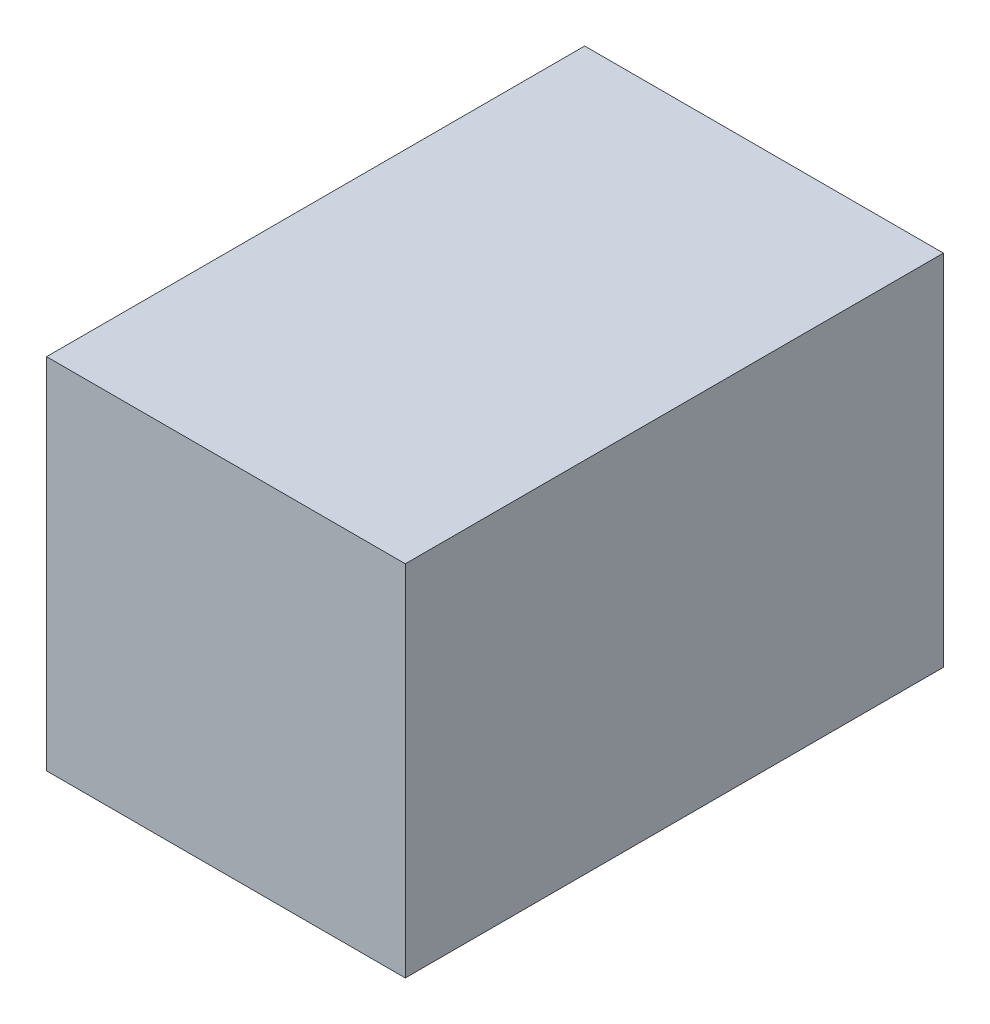
ISO-10303-21;
HEADER;
FILE_DESCRIPTION(('STEP AP214'),'2;1');
FILE_NAME('part.step','',(''),(''),'','','');
FILE_SCHEMA(('AUTOMOTIVE_DESIGN { 1 0 10303 214 1 1 1 1 }'));
ENDSEC;
DATA;
#1=APPLICATION_CONTEXT('core data for automotive mechanical design processes');
#2=APPLICATION_PROTOCOL_DEFINITION('international standard','automotive_design',2000,#1);
#3=PRODUCT_CONTEXT('',#1,'mechanical');
#4=PRODUCT('Part','Part','',(#3));
#5=PRODUCT_RELATED_PRODUCT_CATEGORY('part','',(#4));
#6=PRODUCT_DEFINITION_FORMATION('','',#4);
#7=PRODUCT_DEFINITION_CONTEXT('part definition',#1,'design');
#8=PRODUCT_DEFINITION('design','',#6,#7);
#9=PRODUCT_DEFINITION_SHAPE('','',#8);
#10=(LENGTH_UNIT() NAMED_UNIT(*) SI_UNIT(.MILLI.,.METRE.));
#11=(NAMED_UNIT(*) PLANE_ANGLE_UNIT() SI_UNIT($,.RADIAN.));
#12=(NAMED_UNIT(*) SI_UNIT($,.STERADIAN.) SOLID_ANGLE_UNIT());
#13=UNCERTAINTY_MEASURE_WITH_UNIT(LENGTH_MEASURE(1.E-05),#10,'distance_accuracy_value','');
#14=(GEOMETRIC_REPRESENTATION_CONTEXT(3) GLOBAL_UNCERTAINTY_ASSIGNED_CONTEXT((#13)) GLOBAL_UNIT_ASSIGNED_CONTEXT((#10,
#11,#12)) REPRESENTATION_CONTEXT('',''));
#15=CARTESIAN_POINT('',(0.,0.,0.));
#16=DIRECTION('',(0.,0.,1.));
#17=DIRECTION('',(1.,0.,0.));
#18=AXIS2_PLACEMENT_3D('',#15,#16,#17);
#19=CARTESIAN_POINT('',(1.5875,3.5052,26.46015));
#20=DIRECTION('',(-1.,0.,0.));
#21=DIRECTION('',(0.,0.,1.));
#22=AXIS2_PLACEMENT_3D('',#19,#20,#21);
#23=PLANE('',#22);
#24=DIRECTION('',(0.,1.,0.));
#25=VECTOR('',#24,1.);
#26=CARTESIAN_POINT('',(1.5875,3.5052,21.69765));
#27=LINE('',#26,#25);
#28=CARTESIAN_POINT('',(1.5875,3.5052,21.69765));
#29=VERTEX_POINT('',#28);
#30=CARTESIAN_POINT('',(1.5875,6.6802,21.69765));
#31=VERTEX_POINT('',#30);
#32=EDGE_CURVE('E115',#29,#31,#27,.T.);
#33=ORIENTED_EDGE('',*,*,#32,.T.);
#34=DIRECTION('',(0.,0.,-1.));
#35=VECTOR('',#34,1.);
#36=CARTESIAN_POINT('',(1.5875,6.6802,26.46015));
#37=LINE('',#36,#35);
#38=CARTESIAN_POINT('',(1.5875,6.6802,26.46015));
#39=VERTEX_POINT('',#38);
#40=EDGE_CURVE('E11',#39,#31,#37,.T.);
#41=ORIENTED_EDGE('',*,*,#40,.F.);
#42=DIRECTION('',(0.,1.,0.));
#43=VECTOR('',#42,1.);
#44=CARTESIAN_POINT('',(1.5875,3.5052,26.46015));
#45=LINE('',#44,#43);
#46=CARTESIAN_POINT('',(1.5875,3.5052,26.46015));
#47=VERTEX_POINT('',#46);
#48=EDGE_CURVE('E99',#47,#39,#45,.T.);
#49=ORIENTED_EDGE('',*,*,#48,.F.);
#50=DIRECTION('',(0.,0.,-1.));
#51=VECTOR('',#50,1.);
#52=CARTESIAN_POINT('',(1.5875,3.5052,26.46015));
#53=LINE('',#52,#51);
#54=EDGE_CURVE('E111',#47,#29,#53,.T.);
#55=ORIENTED_EDGE('',*,*,#54,.T.);
#56=EDGE_LOOP('',(#33,#41,#49,#55));
#57=FACE_BOUND('',#56,.T.);
#58=ADVANCED_FACE('F39',(#57),#23,.F.);
#59=CARTESIAN_POINT('',(-1.5875,6.6802,26.46015));
#60=DIRECTION('',(0.,-1.,0.));
#61=DIRECTION('',(0.,0.,-1.));
#62=AXIS2_PLACEMENT_3D('',#59,#60,#61);
#63=PLANE('',#62);
#64=DIRECTION('',(-1.,0.,0.));
#65=VECTOR('',#64,1.);
#66=CARTESIAN_POINT('',(-1.5875,6.6802,21.69765));
#67=LINE('',#66,#65);
#68=CARTESIAN_POINT('',(-1.5875,6.6802,21.69765));
#69=VERTEX_POINT('',#68);
#70=EDGE_CURVE('E104',#31,#69,#67,.T.);
#71=ORIENTED_EDGE('',*,*,#70,.T.);
#72=DIRECTION('',(0.,0.,-1.));
#73=VECTOR('',#72,1.);
#74=CARTESIAN_POINT('',(-1.5875,6.6802,26.46015));
#75=LINE('',#74,#73);
#76=CARTESIAN_POINT('',(-1.5875,6.6802,26.46015));
#77=VERTEX_POINT('',#76);
#78=EDGE_CURVE('E48',#77,#69,#75,.T.);
#79=ORIENTED_EDGE('',*,*,#78,.F.);
#80=DIRECTION('',(-1.,0.,0.));
#81=VECTOR('',#80,1.);
#82=CARTESIAN_POINT('',(-1.5875,6.6802,26.46015));
#83=LINE('',#82,#81);
#84=EDGE_CURVE('E94',#39,#77,#83,.T.);
#85=ORIENTED_EDGE('',*,*,#84,.F.);
#86=ORIENTED_EDGE('',*,*,#40,.T.);
#87=EDGE_LOOP('',(#71,#79,#85,#86));
#88=FACE_BOUND('',#87,.T.);
#89=ADVANCED_FACE('F103',(#88),#63,.F.);
#90=CARTESIAN_POINT('',(-1.5875,3.5052,26.46015));
#91=DIRECTION('',(1.,0.,0.));
#92=DIRECTION('',(0.,0.,-1.));
#93=AXIS2_PLACEMENT_3D('',#90,#91,#92);
#94=PLANE('',#93);
#95=DIRECTION('',(0.,-1.,0.));
#96=VECTOR('',#95,1.);
#97=CARTESIAN_POINT('',(-1.5875,3.5052,21.69765));
#98=LINE('',#97,#96);
#99=CARTESIAN_POINT('',(-1.5875,3.5052,21.69765));
#100=VERTEX_POINT('',#99);
#101=EDGE_CURVE('E80',#69,#100,#98,.T.);
#102=ORIENTED_EDGE('',*,*,#101,.T.);
#103=DIRECTION('',(0.,0.,-1.));
#104=VECTOR('',#103,1.);
#105=CARTESIAN_POINT('',(-1.5875,3.5052,26.46015));
#106=LINE('',#105,#104);
#107=CARTESIAN_POINT('',(-1.5875,3.5052,26.46015));
#108=VERTEX_POINT('',#107);
#109=EDGE_CURVE('E106',#108,#100,#106,.T.);
#110=ORIENTED_EDGE('',*,*,#109,.F.);
#111=DIRECTION('',(0.,-1.,0.));
#112=VECTOR('',#111,1.);
#113=CARTESIAN_POINT('',(-1.5875,3.5052,26.46015));
#114=LINE('',#113,#112);
#115=EDGE_CURVE('E97',#77,#108,#114,.T.);
#116=ORIENTED_EDGE('',*,*,#115,.F.);
#117=ORIENTED_EDGE('',*,*,#78,.T.);
#118=EDGE_LOOP('',(#102,#110,#116,#117));
#119=FACE_BOUND('',#118,.T.);
#120=ADVANCED_FACE('F107',(#119),#94,.F.);
#121=CARTESIAN_POINT('',(-1.5875,3.5052,26.46015));
#122=DIRECTION('',(0.,1.,0.));
#123=DIRECTION('',(0.,0.,1.));
#124=AXIS2_PLACEMENT_3D('',#121,#122,#123);
#125=PLANE('',#124);
#126=DIRECTION('',(1.,0.,0.));
#127=VECTOR('',#126,1.);
#128=CARTESIAN_POINT('',(-1.5875,3.5052,21.69765));
#129=LINE('',#128,#127);
#130=EDGE_CURVE('E87',#100,#29,#129,.T.);
#131=ORIENTED_EDGE('',*,*,#130,.T.);
#132=ORIENTED_EDGE('',*,*,#54,.F.);
#133=DIRECTION('',(1.,0.,0.));
#134=VECTOR('',#133,1.);
#135=CARTESIAN_POINT('',(-1.5875,3.5052,26.46015));
#136=LINE('',#135,#134);
#137=EDGE_CURVE('E59',#108,#47,#136,.T.);
#138=ORIENTED_EDGE('',*,*,#137,.F.);
#139=ORIENTED_EDGE('',*,*,#109,.T.);
#140=EDGE_LOOP('',(#131,#132,#138,#139));
#141=FACE_BOUND('',#140,.T.);
#142=ADVANCED_FACE('F128',(#141),#125,.F.);
#143=CARTESIAN_POINT('',(0.,0.,26.46015));
#144=DIRECTION('',(0.,0.,-1.));
#145=DIRECTION('',(-1.,0.,0.));
#146=AXIS2_PLACEMENT_3D('',#143,#144,#145);
#147=PLANE('',#146);
#148=ORIENTED_EDGE('',*,*,#48,.T.);
#149=ORIENTED_EDGE('',*,*,#84,.T.);
#150=ORIENTED_EDGE('',*,*,#115,.T.);
#151=ORIENTED_EDGE('',*,*,#137,.T.);
#152=EDGE_LOOP('',(#148,#149,#150,#151));
#153=FACE_BOUND('',#152,.T.);
#154=ADVANCED_FACE('F95',(#153),#147,.F.);
#155=CARTESIAN_POINT('',(0.,0.,21.69765));
#156=DIRECTION('',(0.,0.,-1.));
#157=DIRECTION('',(-1.,0.,0.));
#158=AXIS2_PLACEMENT_3D('',#155,#156,#157);
#159=PLANE('',#158);
#160=ORIENTED_EDGE('',*,*,#32,.F.);
#161=ORIENTED_EDGE('',*,*,#130,.F.);
#162=ORIENTED_EDGE('',*,*,#101,.F.);
#163=ORIENTED_EDGE('',*,*,#70,.F.);
#164=EDGE_LOOP('',(#160,#161,#162,#163));
#165=FACE_BOUND('',#164,.T.);
#166=ADVANCED_FACE('F131',(#165),#159,.T.);
#167=CLOSED_SHELL('',(#58,#89,#120,#142,#154,#166));
#168=MANIFOLD_SOLID_BREP('B2',#167);
#169=ADVANCED_BREP_SHAPE_REPRESENTATION('',(#18,#168),#14);
#170=SHAPE_DEFINITION_REPRESENTATION(#9,#169);
ENDSEC;
END-ISO-10303-21;
